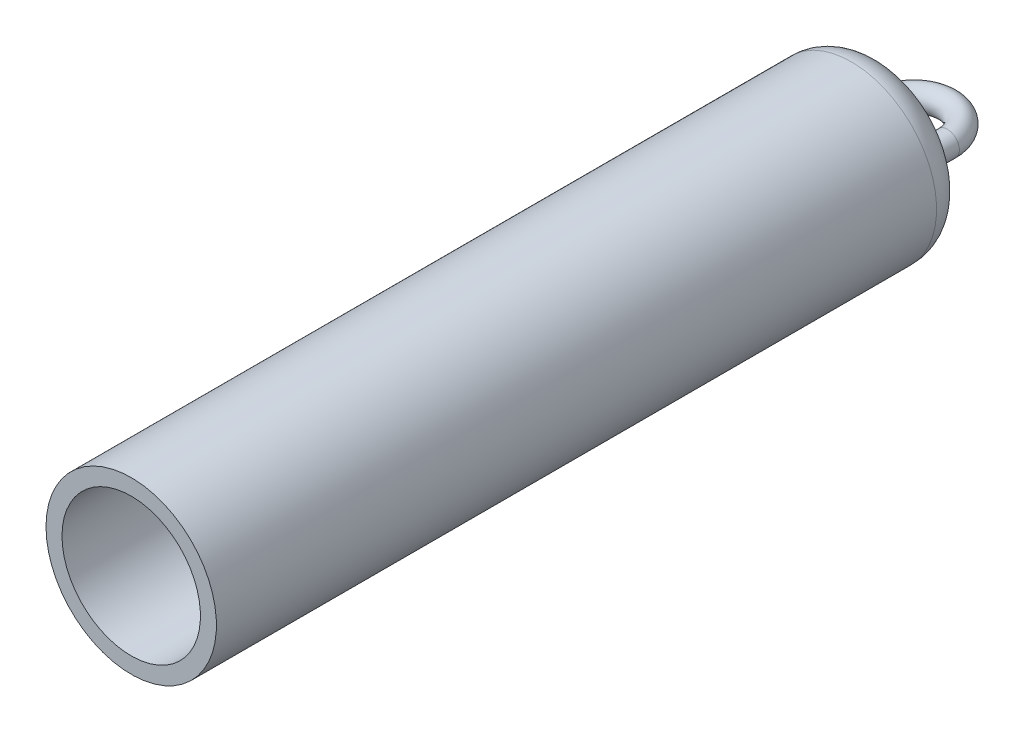
ISO-10303-21;
HEADER;
FILE_DESCRIPTION(('STEP AP214'),'2;1');
FILE_NAME('part.step','',(''),(''),'','','');
FILE_SCHEMA(('AUTOMOTIVE_DESIGN { 1 0 10303 214 1 1 1 1 }'));
ENDSEC;
DATA;
#1=APPLICATION_CONTEXT('core data for automotive mechanical design processes');
#2=APPLICATION_PROTOCOL_DEFINITION('international standard','automotive_design',2000,#1);
#3=PRODUCT_CONTEXT('',#1,'mechanical');
#4=PRODUCT('Part','Part','',(#3));
#5=PRODUCT_RELATED_PRODUCT_CATEGORY('part','',(#4));
#6=PRODUCT_DEFINITION_FORMATION('','',#4);
#7=PRODUCT_DEFINITION_CONTEXT('part definition',#1,'design');
#8=PRODUCT_DEFINITION('design','',#6,#7);
#9=PRODUCT_DEFINITION_SHAPE('','',#8);
#10=(LENGTH_UNIT() NAMED_UNIT(*) SI_UNIT(.MILLI.,.METRE.));
#11=(NAMED_UNIT(*) PLANE_ANGLE_UNIT() SI_UNIT($,.RADIAN.));
#12=(NAMED_UNIT(*) SI_UNIT($,.STERADIAN.) SOLID_ANGLE_UNIT());
#13=UNCERTAINTY_MEASURE_WITH_UNIT(LENGTH_MEASURE(1.E-05),#10,'distance_accuracy_value','');
#14=(GEOMETRIC_REPRESENTATION_CONTEXT(3) GLOBAL_UNCERTAINTY_ASSIGNED_CONTEXT((#13)) GLOBAL_UNIT_ASSIGNED_CONTEXT((#10,
#11,#12)) REPRESENTATION_CONTEXT('',''));
#15=CARTESIAN_POINT('',(0.,0.,0.));
#16=DIRECTION('',(0.,0.,1.));
#17=DIRECTION('',(1.,0.,0.));
#18=AXIS2_PLACEMENT_3D('',#15,#16,#17);
#19=CARTESIAN_POINT('',(0.,0.,45.));
#20=DIRECTION('',(0.,0.,1.));
#21=DIRECTION('',(1.,0.,0.));
#22=AXIS2_PLACEMENT_3D('',#19,#20,#21);
#23=PLANE('',#22);
#24=CARTESIAN_POINT('',(0.,0.,45.));
#25=DIRECTION('',(0.,0.,1.));
#26=DIRECTION('',(1.,0.,0.));
#27=AXIS2_PLACEMENT_3D('',#24,#25,#26);
#28=CIRCLE('',#27,10.65);
#29=CARTESIAN_POINT('',(-10.65,0.,45.));
#30=VERTEX_POINT('',#29);
#31=EDGE_CURVE('E10',#30,#30,#28,.T.);
#32=ORIENTED_EDGE('',*,*,#31,.T.);
#33=EDGE_LOOP('',(#32));
#34=FACE_BOUND('',#33,.T.);
#35=CARTESIAN_POINT('',(0.,0.,45.));
#36=DIRECTION('',(0.,0.,1.));
#37=DIRECTION('',(1.,0.,0.));
#38=AXIS2_PLACEMENT_3D('',#35,#36,#37);
#39=CIRCLE('',#38,8.65);
#40=CARTESIAN_POINT('',(-8.65,0.,45.));
#41=VERTEX_POINT('',#40);
#42=EDGE_CURVE('E40',#41,#41,#39,.T.);
#43=ORIENTED_EDGE('',*,*,#42,.F.);
#44=EDGE_LOOP('',(#43));
#45=FACE_BOUND('',#44,.T.);
#46=ADVANCED_FACE('F32',(#34,#45),#23,.T.);
#47=CARTESIAN_POINT('',(0.,0.,45.));
#48=DIRECTION('',(0.,0.,-1.));
#49=DIRECTION('',(-1.,0.,0.));
#50=AXIS2_PLACEMENT_3D('',#47,#48,#49);
#51=CYLINDRICAL_SURFACE('',#50,10.65);
#52=CARTESIAN_POINT('',(0.,0.,-44.9999999999999));
#53=DIRECTION('',(0.,0.,-1.));
#54=DIRECTION('',(-1.,0.,0.));
#55=AXIS2_PLACEMENT_3D('',#52,#53,#54);
#56=CIRCLE('',#55,10.65);
#57=CARTESIAN_POINT('',(-10.65,0.,-44.9999999999999));
#58=VERTEX_POINT('',#57);
#59=EDGE_CURVE('E54',#58,#58,#56,.T.);
#60=CARTESIAN_POINT('',(-10.65,0.,45.));
#61=CARTESIAN_POINT('',(-10.65,0.,44.0625));
#62=CARTESIAN_POINT('',(-10.65,0.,43.125));
#63=CARTESIAN_POINT('',(-10.65,0.,41.25));
#64=CARTESIAN_POINT('',(-10.65,0.,40.3125));
#65=CARTESIAN_POINT('',(-10.65,0.,38.4375));
#66=CARTESIAN_POINT('',(-10.65,0.,37.5));
#67=CARTESIAN_POINT('',(-10.65,0.,35.625));
#68=CARTESIAN_POINT('',(-10.65,0.,34.6875));
#69=CARTESIAN_POINT('',(-10.65,0.,32.8125));
#70=CARTESIAN_POINT('',(-10.65,0.,31.875));
#71=CARTESIAN_POINT('',(-10.65,0.,30.));
#72=CARTESIAN_POINT('',(-10.65,0.,29.0625));
#73=CARTESIAN_POINT('',(-10.65,0.,27.1875));
#74=CARTESIAN_POINT('',(-10.65,0.,26.25));
#75=CARTESIAN_POINT('',(-10.65,0.,24.375));
#76=CARTESIAN_POINT('',(-10.65,0.,23.4375));
#77=CARTESIAN_POINT('',(-10.65,0.,21.5625));
#78=CARTESIAN_POINT('',(-10.65,0.,20.625));
#79=CARTESIAN_POINT('',(-10.65,0.,18.75));
#80=CARTESIAN_POINT('',(-10.65,0.,17.8125));
#81=CARTESIAN_POINT('',(-10.65,0.,15.9375));
#82=CARTESIAN_POINT('',(-10.65,0.,15.));
#83=CARTESIAN_POINT('',(-10.65,0.,13.125));
#84=CARTESIAN_POINT('',(-10.65,0.,12.1875));
#85=CARTESIAN_POINT('',(-10.65,0.,10.3125));
#86=CARTESIAN_POINT('',(-10.65,0.,9.37500000000003));
#87=CARTESIAN_POINT('',(-10.65,0.,7.50000000000003));
#88=CARTESIAN_POINT('',(-10.65,0.,6.56250000000003));
#89=CARTESIAN_POINT('',(-10.65,0.,4.68750000000003));
#90=CARTESIAN_POINT('',(-10.65,0.,3.75000000000003));
#91=CARTESIAN_POINT('',(-10.65,0.,1.87500000000003));
#92=CARTESIAN_POINT('',(-10.65,0.,0.937500000000033));
#93=CARTESIAN_POINT('',(-10.65,0.,-0.937499999999964));
#94=CARTESIAN_POINT('',(-10.65,0.,-1.87499999999996));
#95=CARTESIAN_POINT('',(-10.65,0.,-3.74999999999996));
#96=CARTESIAN_POINT('',(-10.65,0.,-4.68749999999996));
#97=CARTESIAN_POINT('',(-10.65,0.,-6.56249999999996));
#98=CARTESIAN_POINT('',(-10.65,0.,-7.49999999999996));
#99=CARTESIAN_POINT('',(-10.65,0.,-9.37499999999996));
#100=CARTESIAN_POINT('',(-10.65,0.,-10.3125));
#101=CARTESIAN_POINT('',(-10.65,0.,-12.1875));
#102=CARTESIAN_POINT('',(-10.65,0.,-13.125));
#103=CARTESIAN_POINT('',(-10.65,0.,-15.));
#104=CARTESIAN_POINT('',(-10.65,0.,-15.9375));
#105=CARTESIAN_POINT('',(-10.65,0.,-17.8125));
#106=CARTESIAN_POINT('',(-10.65,0.,-18.7499999999999));
#107=CARTESIAN_POINT('',(-10.65,0.,-20.6249999999999));
#108=CARTESIAN_POINT('',(-10.65,0.,-21.5624999999999));
#109=CARTESIAN_POINT('',(-10.65,0.,-23.4374999999999));
#110=CARTESIAN_POINT('',(-10.65,0.,-24.3749999999999));
#111=CARTESIAN_POINT('',(-10.65,0.,-26.2499999999999));
#112=CARTESIAN_POINT('',(-10.65,0.,-27.1874999999999));
#113=CARTESIAN_POINT('',(-10.65,0.,-29.0624999999999));
#114=CARTESIAN_POINT('',(-10.65,0.,-29.9999999999999));
#115=CARTESIAN_POINT('',(-10.65,0.,-31.8749999999999));
#116=CARTESIAN_POINT('',(-10.65,0.,-32.8124999999999));
#117=CARTESIAN_POINT('',(-10.65,0.,-34.6874999999999));
#118=CARTESIAN_POINT('',(-10.65,0.,-35.6249999999999));
#119=CARTESIAN_POINT('',(-10.65,0.,-37.4999999999999));
#120=CARTESIAN_POINT('',(-10.65,0.,-38.4374999999999));
#121=CARTESIAN_POINT('',(-10.65,0.,-40.3124999999999));
#122=CARTESIAN_POINT('',(-10.65,0.,-41.2499999999999));
#123=CARTESIAN_POINT('',(-10.65,0.,-43.1249999999999));
#124=CARTESIAN_POINT('',(-10.65,0.,-44.0624999999999));
#125=CARTESIAN_POINT('',(-10.65,0.,-44.9999999999999));
#126=B_SPLINE_CURVE_WITH_KNOTS('',3,(#60,#61,#62,#63,#64,#65,#66,#67,#68,#69,#70,#71,#72,#73,
#74,#75,#76,#77,#78,#79,#80,#81,#82,#83,#84,#85,#86,#87,#88,#89,#90,#91,#92,#93,#94,#95,#96,#97,
#98,#99,#100,#101,#102,#103,#104,#105,#106,#107,#108,#109,#110,#111,#112,#113,#114,#115,#116,
#117,#118,#119,#120,#121,#122,#123,#124,#125),.UNSPECIFIED.,.F.,.F.,(4,2,2,2,2,2,2,2,2,2,2,2,2,
2,2,2,2,2,2,2,2,2,2,2,2,2,2,2,2,2,2,2,4),(0.,2.8125,5.625,8.43749999999999,11.25,14.0625,16.875,
19.6875,22.5,25.3125,28.125,30.9375,33.75,36.5625,39.375,42.1875,45.,47.8125,50.625,53.4375,
56.25,59.0625,61.875,64.6874999999999,67.4999999999999,70.3124999999999,73.1249999999999,
75.9374999999999,78.7499999999999,81.5624999999999,84.3749999999999,87.1874999999999,
89.9999999999999),.UNSPECIFIED.);
#127=EDGE_CURVE('BSEAM34',#30,#58,#126,.T.);
#128=ORIENTED_EDGE('',*,*,#31,.F.);
#129=ORIENTED_EDGE('',*,*,#59,.F.);
#130=ORIENTED_EDGE('',*,*,#127,.T.);
#131=ORIENTED_EDGE('',*,*,#127,.F.);
#132=EDGE_LOOP('',(#128,#130,#129,#131));
#133=FACE_BOUND('',#132,.T.);
#134=ADVANCED_FACE('F34',(#133),#51,.T.);
#135=CARTESIAN_POINT('',(0.,0.,45.));
#136=DIRECTION('',(0.,0.,-1.));
#137=DIRECTION('',(-1.,0.,0.));
#138=AXIS2_PLACEMENT_3D('',#135,#136,#137);
#139=CYLINDRICAL_SURFACE('',#138,8.65);
#140=CARTESIAN_POINT('',(0.,0.,-45.));
#141=DIRECTION('',(0.,0.,1.));
#142=DIRECTION('',(1.,0.,0.));
#143=AXIS2_PLACEMENT_3D('',#140,#141,#142);
#144=CIRCLE('',#143,8.65);
#145=CARTESIAN_POINT('',(-8.65,0.,-45.));
#146=VERTEX_POINT('',#145);
#147=EDGE_CURVE('E45',#146,#146,#144,.T.);
#148=CARTESIAN_POINT('',(-8.65,0.,45.));
#149=CARTESIAN_POINT('',(-8.65,0.,44.0625));
#150=CARTESIAN_POINT('',(-8.65,0.,43.125));
#151=CARTESIAN_POINT('',(-8.65,0.,41.25));
#152=CARTESIAN_POINT('',(-8.65,0.,40.3125));
#153=CARTESIAN_POINT('',(-8.65,0.,38.4375));
#154=CARTESIAN_POINT('',(-8.65,0.,37.5));
#155=CARTESIAN_POINT('',(-8.65,0.,35.625));
#156=CARTESIAN_POINT('',(-8.65,0.,34.6875));
#157=CARTESIAN_POINT('',(-8.65,0.,32.8125));
#158=CARTESIAN_POINT('',(-8.65,0.,31.875));
#159=CARTESIAN_POINT('',(-8.65,0.,30.));
#160=CARTESIAN_POINT('',(-8.65,0.,29.0625));
#161=CARTESIAN_POINT('',(-8.65,0.,27.1875));
#162=CARTESIAN_POINT('',(-8.65,0.,26.25));
#163=CARTESIAN_POINT('',(-8.65,0.,24.375));
#164=CARTESIAN_POINT('',(-8.65,0.,23.4375));
#165=CARTESIAN_POINT('',(-8.65,0.,21.5625));
#166=CARTESIAN_POINT('',(-8.65,0.,20.625));
#167=CARTESIAN_POINT('',(-8.65,0.,18.75));
#168=CARTESIAN_POINT('',(-8.65,0.,17.8125));
#169=CARTESIAN_POINT('',(-8.65,0.,15.9375));
#170=CARTESIAN_POINT('',(-8.65,0.,15.));
#171=CARTESIAN_POINT('',(-8.65,0.,13.125));
#172=CARTESIAN_POINT('',(-8.65,0.,12.1875));
#173=CARTESIAN_POINT('',(-8.65,0.,10.3125));
#174=CARTESIAN_POINT('',(-8.65,0.,9.37499999999999));
#175=CARTESIAN_POINT('',(-8.65,0.,7.49999999999999));
#176=CARTESIAN_POINT('',(-8.65,0.,6.56249999999999));
#177=CARTESIAN_POINT('',(-8.65,0.,4.68749999999999));
#178=CARTESIAN_POINT('',(-8.65,0.,3.74999999999999));
#179=CARTESIAN_POINT('',(-8.65,0.,1.87499999999999));
#180=CARTESIAN_POINT('',(-8.65,0.,0.937499999999987));
#181=CARTESIAN_POINT('',(-8.65,0.,-0.937500000000015));
#182=CARTESIAN_POINT('',(-8.65,0.,-1.87500000000002));
#183=CARTESIAN_POINT('',(-8.65,0.,-3.75000000000002));
#184=CARTESIAN_POINT('',(-8.65,0.,-4.68750000000002));
#185=CARTESIAN_POINT('',(-8.65,0.,-6.56250000000002));
#186=CARTESIAN_POINT('',(-8.65,0.,-7.50000000000002));
#187=CARTESIAN_POINT('',(-8.65,0.,-9.37500000000002));
#188=CARTESIAN_POINT('',(-8.65,0.,-10.3125));
#189=CARTESIAN_POINT('',(-8.65,0.,-12.1875));
#190=CARTESIAN_POINT('',(-8.65,0.,-13.125));
#191=CARTESIAN_POINT('',(-8.65,0.,-15.));
#192=CARTESIAN_POINT('',(-8.65,0.,-15.9375));
#193=CARTESIAN_POINT('',(-8.65,0.,-17.8125));
#194=CARTESIAN_POINT('',(-8.65,0.,-18.75));
#195=CARTESIAN_POINT('',(-8.65,0.,-20.625));
#196=CARTESIAN_POINT('',(-8.65,0.,-21.5625));
#197=CARTESIAN_POINT('',(-8.65,0.,-23.4375));
#198=CARTESIAN_POINT('',(-8.65,0.,-24.375));
#199=CARTESIAN_POINT('',(-8.65,0.,-26.25));
#200=CARTESIAN_POINT('',(-8.65,0.,-27.1875));
#201=CARTESIAN_POINT('',(-8.65,0.,-29.0625));
#202=CARTESIAN_POINT('',(-8.65,0.,-30.));
#203=CARTESIAN_POINT('',(-8.65,0.,-31.875));
#204=CARTESIAN_POINT('',(-8.65,0.,-32.8125));
#205=CARTESIAN_POINT('',(-8.65,0.,-34.6875));
#206=CARTESIAN_POINT('',(-8.65,0.,-35.625));
#207=CARTESIAN_POINT('',(-8.65,0.,-37.5));
#208=CARTESIAN_POINT('',(-8.65,0.,-38.4375));
#209=CARTESIAN_POINT('',(-8.65,0.,-40.3125));
#210=CARTESIAN_POINT('',(-8.65,0.,-41.25));
#211=CARTESIAN_POINT('',(-8.65,0.,-43.125));
#212=CARTESIAN_POINT('',(-8.65,0.,-44.0625));
#213=CARTESIAN_POINT('',(-8.65,0.,-45.));
#214=B_SPLINE_CURVE_WITH_KNOTS('',3,(#148,#149,#150,#151,#152,#153,#154,#155,#156,#157,#158,
#159,#160,#161,#162,#163,#164,#165,#166,#167,#168,#169,#170,#171,#172,#173,#174,#175,#176,#177,
#178,#179,#180,#181,#182,#183,#184,#185,#186,#187,#188,#189,#190,#191,#192,#193,#194,#195,#196,
#197,#198,#199,#200,#201,#202,#203,#204,#205,#206,#207,#208,#209,#210,#211,#212,#213),
.UNSPECIFIED.,.F.,.F.,(4,2,2,2,2,2,2,2,2,2,2,2,2,2,2,2,2,2,2,2,2,2,2,2,2,2,2,2,2,2,2,2,4),(0.,
2.8125,5.625,8.43749999999999,11.25,14.0625,16.875,19.6875,22.5,25.3125,28.125,30.9375,33.75,
36.5625,39.375,42.1875,45.,47.8125,50.625,53.4375,56.25,59.0625,61.875,64.6875,67.5,70.3125,
73.125,75.9375,78.75,81.5625,84.375,87.1875,90.),.UNSPECIFIED.);
#215=EDGE_CURVE('BSEAM74',#41,#146,#214,.T.);
#216=ORIENTED_EDGE('',*,*,#42,.T.);
#217=ORIENTED_EDGE('',*,*,#147,.F.);
#218=ORIENTED_EDGE('',*,*,#215,.T.);
#219=ORIENTED_EDGE('',*,*,#215,.F.);
#220=EDGE_LOOP('',(#216,#218,#217,#219));
#221=FACE_BOUND('',#220,.T.);
#222=ADVANCED_FACE('F74',(#221),#139,.F.);
#223=CARTESIAN_POINT('',(0.,0.,-45.));
#224=DIRECTION('',(0.,0.,1.));
#225=DIRECTION('',(1.,0.,0.));
#226=AXIS2_PLACEMENT_3D('',#223,#224,#225);
#227=PLANE('',#226);
#228=ORIENTED_EDGE('',*,*,#147,.T.);
#229=EDGE_LOOP('',(#228));
#230=FACE_BOUND('',#229,.T.);
#231=ADVANCED_FACE('F72',(#230),#227,.T.);
#232=CARTESIAN_POINT('',(0.,0.,-44.9999999999999));
#233=DIRECTION('',(0.,0.,-1.));
#234=DIRECTION('',(-1.,0.,0.));
#235=AXIS2_PLACEMENT_3D('',#232,#233,#234);
#236=TOROIDAL_SURFACE('',#235,6.64999999999994,4.00000000000006);
#237=ORIENTED_EDGE('',*,*,#59,.T.);
#238=EDGE_LOOP('',(#237));
#239=FACE_BOUND('',#238,.T.);
#240=CARTESIAN_POINT('',(0.,0.,-49.));
#241=DIRECTION('',(0.,0.,-1.));
#242=DIRECTION('',(-1.,0.,0.));
#243=AXIS2_PLACEMENT_3D('',#240,#241,#242);
#244=CIRCLE('',#243,6.64999999999994);
#245=CARTESIAN_POINT('',(-6.64999999999994,0.,-49.));
#246=VERTEX_POINT('',#245);
#247=EDGE_CURVE('E65',#246,#246,#244,.T.);
#248=ORIENTED_EDGE('',*,*,#247,.F.);
#249=EDGE_LOOP('',(#248));
#250=FACE_BOUND('',#249,.T.);
#251=ADVANCED_FACE('F82',(#239,#250),#236,.T.);
#252=CARTESIAN_POINT('',(-6.64999999999994,0.,-49.));
#253=DIRECTION('',(0.,0.,-1.));
#254=DIRECTION('',(-1.,0.,0.));
#255=AXIS2_PLACEMENT_3D('',#252,#253,#254);
#256=PLANE('',#255);
#257=CARTESIAN_POINT('',(4.14999999999999,0.,-49.));
#258=DIRECTION('',(0.,0.,-1.));
#259=DIRECTION('',(-1.,0.,0.));
#260=AXIS2_PLACEMENT_3D('',#257,#258,#259);
#261=CIRCLE('',#260,1.5);
#262=CARTESIAN_POINT('',(2.64999999999999,0.,-49.));
#263=VERTEX_POINT('',#262);
#264=EDGE_CURVE('E36',#263,#263,#261,.F.);
#265=ORIENTED_EDGE('',*,*,#264,.T.);
#266=EDGE_LOOP('',(#265));
#267=FACE_BOUND('',#266,.T.);
#268=CARTESIAN_POINT('',(-4.14999999999999,0.,-49.));
#269=DIRECTION('',(0.,0.,-1.));
#270=DIRECTION('',(-1.,0.,0.));
#271=AXIS2_PLACEMENT_3D('',#268,#269,#270);
#272=CIRCLE('',#271,1.5);
#273=CARTESIAN_POINT('',(-5.64999999999999,0.,-49.));
#274=VERTEX_POINT('',#273);
#275=EDGE_CURVE('E48',#274,#274,#272,.F.);
#276=ORIENTED_EDGE('',*,*,#275,.T.);
#277=EDGE_LOOP('',(#276));
#278=FACE_BOUND('',#277,.T.);
#279=ORIENTED_EDGE('',*,*,#247,.T.);
#280=EDGE_LOOP('',(#279));
#281=FACE_BOUND('',#280,.T.);
#282=ADVANCED_FACE('F109',(#267,#278,#281),#256,.T.);
#283=CARTESIAN_POINT('',(4.14999999999999,0.,-45.));
#284=DIRECTION('',(0.,0.,-1.));
#285=DIRECTION('',(-1.,0.,0.));
#286=AXIS2_PLACEMENT_3D('',#283,#284,#285);
#287=CYLINDRICAL_SURFACE('',#286,1.5);
#288=ORIENTED_EDGE('',*,*,#264,.F.);
#289=EDGE_LOOP('',(#288));
#290=FACE_BOUND('',#289,.T.);
#291=CARTESIAN_POINT('',(4.14999999999999,0.,-52.85));
#292=DIRECTION('',(0.,0.,1.));
#293=DIRECTION('',(1.,0.,0.));
#294=AXIS2_PLACEMENT_3D('',#291,#292,#293);
#295=CIRCLE('',#294,1.5);
#296=CARTESIAN_POINT('',(5.65,0.,-52.85));
#297=VERTEX_POINT('',#296);
#298=EDGE_CURVE('E56',#297,#297,#295,.T.);
#299=ORIENTED_EDGE('',*,*,#298,.T.);
#300=EDGE_LOOP('',(#299));
#301=FACE_BOUND('',#300,.T.);
#302=ADVANCED_FACE('F123',(#290,#301),#287,.T.);
#303=CARTESIAN_POINT('',(0.,0.,-52.85));
#304=DIRECTION('',(0.,1.,0.));
#305=DIRECTION('',(0.,0.,1.));
#306=AXIS2_PLACEMENT_3D('',#303,#304,#305);
#307=TOROIDAL_SURFACE('',#306,4.14999999999999,1.5);
#308=CARTESIAN_POINT('',(-4.14999999999999,0.,-52.85));
#309=DIRECTION('',(0.,0.,-1.));
#310=DIRECTION('',(-1.,0.,0.));
#311=AXIS2_PLACEMENT_3D('',#308,#309,#310);
#312=CIRCLE('',#311,1.5);
#313=CARTESIAN_POINT('',(-5.65,0.,-52.85));
#314=VERTEX_POINT('',#313);
#315=EDGE_CURVE('E50',#314,#314,#312,.T.);
#316=CARTESIAN_POINT('',(0.,0.,-52.85));
#317=DIRECTION('',(0.,1.,0.));
#318=DIRECTION('',(0.,0.,1.));
#319=AXIS2_PLACEMENT_3D('',#316,#317,#318);
#320=CIRCLE('',#319,5.65);
#321=EDGE_CURVE('',#297,#314,#320,.T.);
#322=ORIENTED_EDGE('',*,*,#298,.F.);
#323=ORIENTED_EDGE('',*,*,#315,.T.);
#324=ORIENTED_EDGE('',*,*,#321,.T.);
#325=ORIENTED_EDGE('',*,*,#321,.F.);
#326=EDGE_LOOP('',(#322,#324,#323,#325));
#327=FACE_BOUND('',#326,.T.);
#328=ADVANCED_FACE('F134',(#327),#307,.T.);
#329=CARTESIAN_POINT('',(-4.14999999999999,0.,-52.85));
#330=DIRECTION('',(0.,0.,1.));
#331=DIRECTION('',(1.,0.,0.));
#332=AXIS2_PLACEMENT_3D('',#329,#330,#331);
#333=CYLINDRICAL_SURFACE('',#332,1.5);
#334=ORIENTED_EDGE('',*,*,#275,.F.);
#335=EDGE_LOOP('',(#334));
#336=FACE_BOUND('',#335,.T.);
#337=ORIENTED_EDGE('',*,*,#315,.F.);
#338=EDGE_LOOP('',(#337));
#339=FACE_BOUND('',#338,.T.);
#340=ADVANCED_FACE('F126',(#336,#339),#333,.T.);
#341=CLOSED_SHELL('',(#46,#134,#222,#231,#251,#282,#302,#328,#340));
#342=MANIFOLD_SOLID_BREP('B2',#341);
#343=ADVANCED_BREP_SHAPE_REPRESENTATION('',(#18,#342),#14);
#344=SHAPE_DEFINITION_REPRESENTATION(#9,#343);
ENDSEC;
END-ISO-10303-21;
